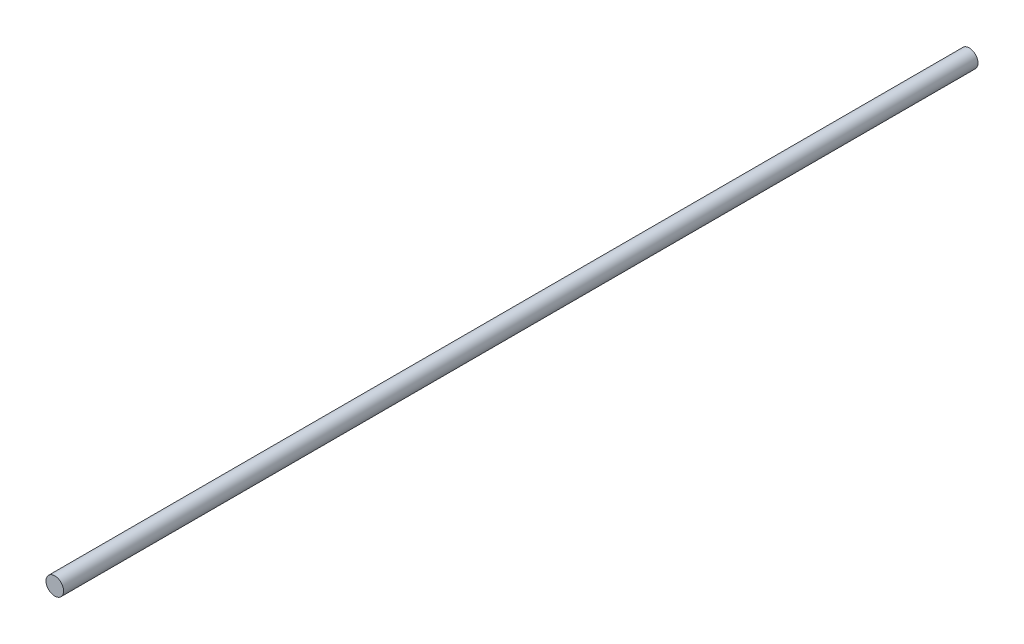
ISO-10303-21;
HEADER;
FILE_DESCRIPTION(('STEP AP214'),'2;1');
FILE_NAME('part.step','',(''),(''),'','','');
FILE_SCHEMA(('AUTOMOTIVE_DESIGN { 1 0 10303 214 1 1 1 1 }'));
ENDSEC;
DATA;
#1=APPLICATION_CONTEXT('core data for automotive mechanical design processes');
#2=APPLICATION_PROTOCOL_DEFINITION('international standard','automotive_design',2000,#1);
#3=PRODUCT_CONTEXT('',#1,'mechanical');
#4=PRODUCT('Part','Part','',(#3));
#5=PRODUCT_RELATED_PRODUCT_CATEGORY('part','',(#4));
#6=PRODUCT_DEFINITION_FORMATION('','',#4);
#7=PRODUCT_DEFINITION_CONTEXT('part definition',#1,'design');
#8=PRODUCT_DEFINITION('design','',#6,#7);
#9=PRODUCT_DEFINITION_SHAPE('','',#8);
#10=(LENGTH_UNIT() NAMED_UNIT(*) SI_UNIT(.MILLI.,.METRE.));
#11=(NAMED_UNIT(*) PLANE_ANGLE_UNIT() SI_UNIT($,.RADIAN.));
#12=(NAMED_UNIT(*) SI_UNIT($,.STERADIAN.) SOLID_ANGLE_UNIT());
#13=UNCERTAINTY_MEASURE_WITH_UNIT(LENGTH_MEASURE(1.E-05),#10,'distance_accuracy_value','');
#14=(GEOMETRIC_REPRESENTATION_CONTEXT(3) GLOBAL_UNCERTAINTY_ASSIGNED_CONTEXT((#13)) GLOBAL_UNIT_ASSIGNED_CONTEXT((#10,
#11,#12)) REPRESENTATION_CONTEXT('',''));
#15=CARTESIAN_POINT('',(0.,0.,0.));
#16=DIRECTION('',(0.,0.,1.));
#17=DIRECTION('',(1.,0.,0.));
#18=AXIS2_PLACEMENT_3D('',#15,#16,#17);
#19=CARTESIAN_POINT('',(-177.8,-95.249999999998,0.));
#20=DIRECTION('',(0.,0.,1.));
#21=DIRECTION('',(1.,0.,0.));
#22=AXIS2_PLACEMENT_3D('',#19,#20,#21);
#23=PLANE('',#22);
#24=CARTESIAN_POINT('',(-177.8,-95.249999999998,0.));
#25=DIRECTION('',(0.,0.,1.));
#26=DIRECTION('',(1.,0.,0.));
#27=AXIS2_PLACEMENT_3D('',#24,#25,#26);
#28=CIRCLE('',#27,6.34999999999999);
#29=CARTESIAN_POINT('',(-171.45,-95.249999999998,0.));
#30=VERTEX_POINT('',#29);
#31=EDGE_CURVE('E46',#30,#30,#28,.T.);
#32=ORIENTED_EDGE('',*,*,#31,.F.);
#33=EDGE_LOOP('',(#32));
#34=FACE_BOUND('',#33,.T.);
#35=ADVANCED_FACE('F39',(#34),#23,.F.);
#36=CARTESIAN_POINT('',(-177.8,-95.249999999998,805.360512242138));
#37=DIRECTION('',(0.,0.,-1.));
#38=DIRECTION('',(-1.,0.,0.));
#39=AXIS2_PLACEMENT_3D('',#36,#37,#38);
#40=CYLINDRICAL_SURFACE('',#39,6.34999999999999);
#41=CARTESIAN_POINT('',(-177.8,-95.249999999998,660.4));
#42=DIRECTION('',(0.,0.,-1.));
#43=DIRECTION('',(-1.,0.,0.));
#44=AXIS2_PLACEMENT_3D('',#41,#42,#43);
#45=CIRCLE('',#44,6.34999999999999);
#46=CARTESIAN_POINT('',(-184.15,-95.249999999998,660.4));
#47=VERTEX_POINT('',#46);
#48=EDGE_CURVE('E10',#47,#47,#45,.T.);
#49=ORIENTED_EDGE('',*,*,#48,.T.);
#50=EDGE_LOOP('',(#49));
#51=FACE_BOUND('',#50,.T.);
#52=ORIENTED_EDGE('',*,*,#31,.T.);
#53=EDGE_LOOP('',(#52));
#54=FACE_BOUND('',#53,.T.);
#55=ADVANCED_FACE('F41',(#51,#54),#40,.T.);
#56=CARTESIAN_POINT('',(-304.8,-120.649999999998,660.4));
#57=DIRECTION('',(0.,0.,-1.));
#58=DIRECTION('',(0.,1.,0.));
#59=AXIS2_PLACEMENT_3D('',#56,#57,#58);
#60=PLANE('',#59);
#61=ORIENTED_EDGE('',*,*,#48,.F.);
#62=EDGE_LOOP('',(#61));
#63=FACE_BOUND('',#62,.T.);
#64=ADVANCED_FACE('F57',(#63),#60,.F.);
#65=CLOSED_SHELL('',(#35,#55,#64));
#66=MANIFOLD_SOLID_BREP('B2',#65);
#67=ADVANCED_BREP_SHAPE_REPRESENTATION('',(#18,#66),#14);
#68=SHAPE_DEFINITION_REPRESENTATION(#9,#67);
ENDSEC;
END-ISO-10303-21;
